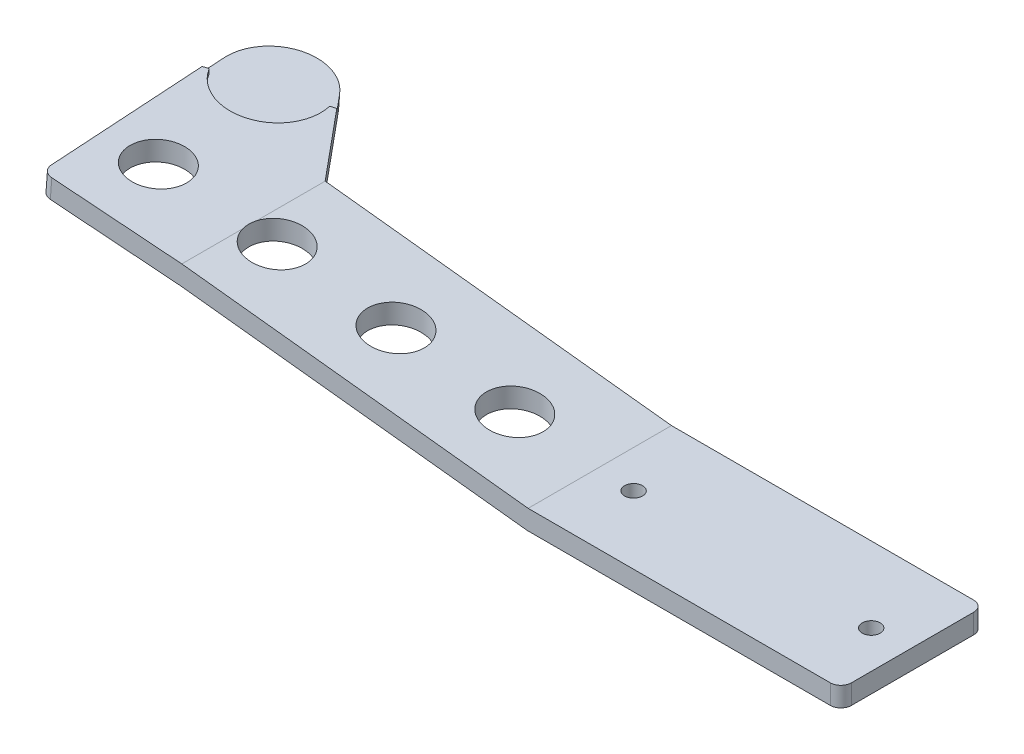
ISO-10303-21;
HEADER;
FILE_DESCRIPTION(('STEP AP214'),'2;1');
FILE_NAME('part.step','',(''),(''),'','','');
FILE_SCHEMA(('AUTOMOTIVE_DESIGN { 1 0 10303 214 1 1 1 1 }'));
ENDSEC;
DATA;
#1=APPLICATION_CONTEXT('core data for automotive mechanical design processes');
#2=APPLICATION_PROTOCOL_DEFINITION('international standard','automotive_design',2000,#1);
#3=PRODUCT_CONTEXT('',#1,'mechanical');
#4=PRODUCT('Part','Part','',(#3));
#5=PRODUCT_RELATED_PRODUCT_CATEGORY('part','',(#4));
#6=PRODUCT_DEFINITION_FORMATION('','',#4);
#7=PRODUCT_DEFINITION_CONTEXT('part definition',#1,'design');
#8=PRODUCT_DEFINITION('design','',#6,#7);
#9=PRODUCT_DEFINITION_SHAPE('','',#8);
#10=(LENGTH_UNIT() NAMED_UNIT(*) SI_UNIT(.MILLI.,.METRE.));
#11=(NAMED_UNIT(*) PLANE_ANGLE_UNIT() SI_UNIT($,.RADIAN.));
#12=(NAMED_UNIT(*) SI_UNIT($,.STERADIAN.) SOLID_ANGLE_UNIT());
#13=UNCERTAINTY_MEASURE_WITH_UNIT(LENGTH_MEASURE(1.E-05),#10,'distance_accuracy_value','');
#14=(GEOMETRIC_REPRESENTATION_CONTEXT(3) GLOBAL_UNCERTAINTY_ASSIGNED_CONTEXT((#13)) GLOBAL_UNIT_ASSIGNED_CONTEXT((#10,
#11,#12)) REPRESENTATION_CONTEXT('',''));
#15=CARTESIAN_POINT('',(0.,0.,0.));
#16=DIRECTION('',(0.,0.,1.));
#17=DIRECTION('',(1.,0.,0.));
#18=AXIS2_PLACEMENT_3D('',#15,#16,#17);
#19=CARTESIAN_POINT('',(-130.997092737255,-22.6984514156349,-8.89));
#20=DIRECTION('',(0.0739394580692496,0.99726273195203,0.));
#21=DIRECTION('',(-0.99726273195203,0.0739394580692496,0.));
#22=AXIS2_PLACEMENT_3D('',#19,#20,#21);
#23=CYLINDRICAL_SURFACE('',#22,7.93749999999999);
#24=DIRECTION('',(0.0739394580692496,0.99726273195203,0.));
#25=VECTOR('',#24,1.);
#26=CARTESIAN_POINT('',(-138.912865672124,-22.1115569672102,-8.89));
#27=LINE('',#26,#25);
#28=CARTESIAN_POINT('',(-136.652,8.38199999999976,-8.89));
#29=VERTEX_POINT('',#28);
#30=CARTESIAN_POINT('',(-136.473584087679,10.7883949722002,-8.89));
#31=VERTEX_POINT('',#30);
#32=EDGE_CURVE('E201',#29,#31,#27,.T.);
#33=ORIENTED_EDGE('',*,*,#32,.T.);
#34=CARTESIAN_POINT('',(-128.55781115281,10.2015005237755,-8.89));
#35=DIRECTION('',(0.0739394580692496,0.99726273195203,0.));
#36=DIRECTION('',(-0.99726273195203,0.0739394580692496,0.));
#37=AXIS2_PLACEMENT_3D('',#34,#35,#36);
#38=CIRCLE('',#37,7.93749999999993);
#39=CARTESIAN_POINT('',(-122.445042320525,9.74828513701677,-13.9330704205128));
#40=VERTEX_POINT('',#39);
#41=EDGE_CURVE('E47',#40,#31,#38,.T.);
#42=ORIENTED_EDGE('',*,*,#41,.F.);
#43=DIRECTION('',(0.0739394580692496,0.99726273195203,0.));
#44=VECTOR('',#43,1.);
#45=CARTESIAN_POINT('',(-124.88432390497,-23.1516668023936,-13.9330704205129));
#46=LINE('',#45,#44);
#47=CARTESIAN_POINT('',(-122.623458232846,7.34189016481652,-13.9330704205129));
#48=VERTEX_POINT('',#47);
#49=EDGE_CURVE('E209',#48,#40,#46,.T.);
#50=ORIENTED_EDGE('',*,*,#49,.F.);
#51=CARTESIAN_POINT('',(-128.736227065131,7.79510555157529,-8.89));
#52=DIRECTION('',(0.0739394580692499,0.99726273195203,0.));
#53=DIRECTION('',(-0.99726273195203,0.0739394580692499,0.));
#54=AXIS2_PLACEMENT_3D('',#51,#52,#53);
#55=CIRCLE('',#54,7.93749999999999);
#56=EDGE_CURVE('E198',#29,#48,#55,.F.);
#57=ORIENTED_EDGE('',*,*,#56,.F.);
#58=EDGE_LOOP('',(#33,#42,#50,#57));
#59=FACE_BOUND('',#58,.T.);
#60=ADVANCED_FACE('F33',(#59),#23,.T.);
#61=CARTESIAN_POINT('',(0.,0.,0.));
#62=DIRECTION('',(0.,0.,1.));
#63=DIRECTION('',(1.,0.,0.));
#64=AXIS2_PLACEMENT_3D('',#61,#62,#63);
#65=PLANE('',#64);
#66=DIRECTION('',(-1.,0.,0.));
#67=VECTOR('',#66,1.);
#68=CARTESIAN_POINT('',(0.,3.302,0.));
#69=LINE('',#68,#67);
#70=CARTESIAN_POINT('',(-1.778,3.302,0.));
#71=VERTEX_POINT('',#70);
#72=CARTESIAN_POINT('',(-52.6489034519903,3.30199999999999,0.));
#73=VERTEX_POINT('',#72);
#74=EDGE_CURVE('E246',#71,#73,#69,.T.);
#75=ORIENTED_EDGE('',*,*,#74,.F.);
#76=DIRECTION('',(0.,1.,0.));
#77=VECTOR('',#76,1.);
#78=CARTESIAN_POINT('',(-1.778,0.,0.));
#79=LINE('',#78,#77);
#80=CARTESIAN_POINT('',(-1.778,0.,0.));
#81=VERTEX_POINT('',#80);
#82=EDGE_CURVE('E41',#71,#81,#79,.F.);
#83=ORIENTED_EDGE('',*,*,#82,.T.);
#84=DIRECTION('',(1.,0.,0.));
#85=VECTOR('',#84,1.);
#86=CARTESIAN_POINT('',(0.,0.,0.));
#87=LINE('',#86,#85);
#88=CARTESIAN_POINT('',(-52.832,0.,0.));
#89=VERTEX_POINT('',#88);
#90=EDGE_CURVE('E250',#89,#81,#87,.T.);
#91=ORIENTED_EDGE('',*,*,#90,.F.);
#92=DIRECTION('',(0.99386940137254,-0.110560449598353,0.));
#93=VECTOR('',#92,1.);
#94=CARTESIAN_POINT('',(-111.252,6.4987828950322,0.));
#95=LINE('',#94,#93);
#96=CARTESIAN_POINT('',(-111.252,6.49878289503219,0.));
#97=VERTEX_POINT('',#96);
#98=EDGE_CURVE('E267',#97,#89,#95,.T.);
#99=ORIENTED_EDGE('',*,*,#98,.F.);
#100=DIRECTION('',(-0.99726273195203,0.0739394580692499,0.));
#101=VECTOR('',#100,1.);
#102=CARTESIAN_POINT('',(-111.1914357036,6.49429251239711,0.));
#103=LINE('',#102,#101);
#104=CARTESIAN_POINT('',(-111.1914357036,6.49429251239711,0.));
#105=VERTEX_POINT('',#104);
#106=EDGE_CURVE('E200',#105,#97,#103,.T.);
#107=ORIENTED_EDGE('',*,*,#106,.F.);
#108=DIRECTION('',(0.0739394580692496,0.99726273195203,0.));
#109=VECTOR('',#108,1.);
#110=CARTESIAN_POINT('',(-113.452301375724,-23.9992644548131,0.));
#111=LINE('',#110,#109);
#112=CARTESIAN_POINT('',(-110.947287613055,9.78725405330271,0.));
#113=VERTEX_POINT('',#112);
#114=EDGE_CURVE('E206',#105,#113,#111,.T.);
#115=ORIENTED_EDGE('',*,*,#114,.T.);
#116=DIRECTION('',(-0.99386940137254,0.110560449598353,0.));
#117=VECTOR('',#116,1.);
#118=CARTESIAN_POINT('',(-52.6489034519903,3.30199999999999,0.));
#119=LINE('',#118,#117);
#120=EDGE_CURVE('E264',#73,#113,#119,.T.);
#121=ORIENTED_EDGE('',*,*,#120,.F.);
#122=EDGE_LOOP('',(#75,#83,#91,#99,#107,#115,#121));
#123=FACE_BOUND('',#122,.T.);
#124=ADVANCED_FACE('F344',(#123),#65,.F.);
#125=CARTESIAN_POINT('',(0.,0.,24.13));
#126=DIRECTION('',(-1.,0.,0.));
#127=DIRECTION('',(0.,-1.,0.));
#128=AXIS2_PLACEMENT_3D('',#125,#126,#127);
#129=PLANE('',#128);
#130=DIRECTION('',(0.,0.,-1.));
#131=VECTOR('',#130,1.);
#132=CARTESIAN_POINT('',(0.,3.302,24.13));
#133=LINE('',#132,#131);
#134=CARTESIAN_POINT('',(0.,3.302,22.352));
#135=VERTEX_POINT('',#134);
#136=CARTESIAN_POINT('',(0.,3.302,1.77800000000001));
#137=VERTEX_POINT('',#136);
#138=EDGE_CURVE('E285',#135,#137,#133,.T.);
#139=ORIENTED_EDGE('',*,*,#138,.F.);
#140=DIRECTION('',(0.,1.,0.));
#141=VECTOR('',#140,1.);
#142=CARTESIAN_POINT('',(0.,0.,22.352));
#143=LINE('',#142,#141);
#144=CARTESIAN_POINT('',(0.,0.,22.352));
#145=VERTEX_POINT('',#144);
#146=EDGE_CURVE('E315',#135,#145,#143,.F.);
#147=ORIENTED_EDGE('',*,*,#146,.T.);
#148=DIRECTION('',(0.,0.,-1.));
#149=VECTOR('',#148,1.);
#150=CARTESIAN_POINT('',(0.,0.,24.13));
#151=LINE('',#150,#149);
#152=CARTESIAN_POINT('',(0.,0.,1.77800000000001));
#153=VERTEX_POINT('',#152);
#154=EDGE_CURVE('E262',#145,#153,#151,.T.);
#155=ORIENTED_EDGE('',*,*,#154,.T.);
#156=DIRECTION('',(0.,1.,0.));
#157=VECTOR('',#156,1.);
#158=CARTESIAN_POINT('',(0.,0.,1.778));
#159=LINE('',#158,#157);
#160=EDGE_CURVE('E312',#153,#137,#159,.T.);
#161=ORIENTED_EDGE('',*,*,#160,.T.);
#162=EDGE_LOOP('',(#139,#147,#155,#161));
#163=FACE_BOUND('',#162,.T.);
#164=ADVANCED_FACE('F339',(#163),#129,.F.);
#165=CARTESIAN_POINT('',(0.,3.302,24.13));
#166=DIRECTION('',(0.,-1.,0.));
#167=DIRECTION('',(1.,0.,0.));
#168=AXIS2_PLACEMENT_3D('',#165,#166,#167);
#169=PLANE('',#168);
#170=CARTESIAN_POINT('',(-6.32445172599513,3.302,12.7));
#171=DIRECTION('',(0.,-1.,0.));
#172=DIRECTION('',(1.,0.,0.));
#173=AXIS2_PLACEMENT_3D('',#170,#171,#172);
#174=CIRCLE('',#173,1.5113);
#175=CARTESIAN_POINT('',(-4.81315172599513,3.302,12.7));
#176=VERTEX_POINT('',#175);
#177=EDGE_CURVE('E224',#176,#176,#174,.T.);
#178=ORIENTED_EDGE('',*,*,#177,.T.);
#179=EDGE_LOOP('',(#178));
#180=FACE_BOUND('',#179,.T.);
#181=CARTESIAN_POINT('',(-46.3244517259951,3.30199999999999,12.7));
#182=DIRECTION('',(0.,-1.,0.));
#183=DIRECTION('',(1.,0.,0.));
#184=AXIS2_PLACEMENT_3D('',#181,#182,#183);
#185=CIRCLE('',#184,1.5113);
#186=CARTESIAN_POINT('',(-44.8131517259951,3.30199999999999,12.7));
#187=VERTEX_POINT('',#186);
#188=EDGE_CURVE('E219',#187,#187,#185,.T.);
#189=ORIENTED_EDGE('',*,*,#188,.T.);
#190=EDGE_LOOP('',(#189));
#191=FACE_BOUND('',#190,.T.);
#192=DIRECTION('',(-1.,0.,0.));
#193=VECTOR('',#192,1.);
#194=CARTESIAN_POINT('',(0.,3.302,24.13));
#195=LINE('',#194,#193);
#196=CARTESIAN_POINT('',(-1.778,3.302,24.13));
#197=VERTEX_POINT('',#196);
#198=CARTESIAN_POINT('',(-52.6489034519903,3.30199999999999,24.13));
#199=VERTEX_POINT('',#198);
#200=EDGE_CURVE('E247',#197,#199,#195,.T.);
#201=ORIENTED_EDGE('',*,*,#200,.F.);
#202=CARTESIAN_POINT('',(-1.778,3.302,22.352));
#203=DIRECTION('',(0.,-1.,0.));
#204=DIRECTION('',(1.,0.,0.));
#205=AXIS2_PLACEMENT_3D('',#202,#203,#204);
#206=CIRCLE('',#205,1.778);
#207=EDGE_CURVE('E310',#197,#135,#206,.F.);
#208=ORIENTED_EDGE('',*,*,#207,.T.);
#209=ORIENTED_EDGE('',*,*,#138,.T.);
#210=CARTESIAN_POINT('',(-1.778,3.302,1.778));
#211=DIRECTION('',(0.,-1.,0.));
#212=DIRECTION('',(1.,0.,0.));
#213=AXIS2_PLACEMENT_3D('',#210,#211,#212);
#214=CIRCLE('',#213,1.778);
#215=EDGE_CURVE('E308',#137,#71,#214,.F.);
#216=ORIENTED_EDGE('',*,*,#215,.T.);
#217=ORIENTED_EDGE('',*,*,#74,.T.);
#218=DIRECTION('',(0.,0.,-1.));
#219=VECTOR('',#218,1.);
#220=CARTESIAN_POINT('',(-52.6489034519903,3.30199999999999,24.13));
#221=LINE('',#220,#219);
#222=EDGE_CURVE('E282',#199,#73,#221,.T.);
#223=ORIENTED_EDGE('',*,*,#222,.F.);
#224=EDGE_LOOP('',(#201,#208,#209,#216,#217,#223));
#225=FACE_BOUND('',#224,.T.);
#226=ADVANCED_FACE('F336',(#180,#191,#225),#169,.F.);
#227=CARTESIAN_POINT('',(-52.6489034519903,3.30199999999999,24.13));
#228=DIRECTION('',(-0.110560449598353,-0.993869401372539,0.));
#229=DIRECTION('',(0.99386940137254,-0.110560449598353,0.));
#230=AXIS2_PLACEMENT_3D('',#227,#228,#229);
#231=PLANE('',#230);
#232=CARTESIAN_POINT('',(-66.3244517259951,4.82330125305186,12.7));
#233=DIRECTION('',(-0.110560449598353,-0.993869401372539,0.));
#234=DIRECTION('',(-0.99386940137254,0.110560449598353,0.));
#235=AXIS2_PLACEMENT_3D('',#232,#233,#234);
#236=ELLIPSE('',#235,4.79187707501907,4.7625);
#237=CARTESIAN_POINT('',(-71.0869517259951,5.35309333688601,12.7));
#238=VERTEX_POINT('',#237);
#239=EDGE_CURVE('E239',#238,#238,#236,.T.);
#240=ORIENTED_EDGE('',*,*,#239,.T.);
#241=EDGE_LOOP('',(#240));
#242=FACE_BOUND('',#241,.T.);
#243=CARTESIAN_POINT('',(-86.3244517259951,7.04814989907453,12.7));
#244=DIRECTION('',(-0.110560449598353,-0.993869401372539,0.));
#245=DIRECTION('',(-0.99386940137254,0.110560449598353,0.));
#246=AXIS2_PLACEMENT_3D('',#243,#244,#245);
#247=ELLIPSE('',#246,4.79187707501907,4.7625);
#248=CARTESIAN_POINT('',(-91.0869517259951,7.57794198290868,12.7));
#249=VERTEX_POINT('',#248);
#250=EDGE_CURVE('E235',#249,#249,#247,.T.);
#251=ORIENTED_EDGE('',*,*,#250,.T.);
#252=EDGE_LOOP('',(#251));
#253=FACE_BOUND('',#252,.T.);
#254=DIRECTION('',(0.,0.,-1.));
#255=VECTOR('',#254,1.);
#256=CARTESIAN_POINT('',(-110.947287613055,9.78725405330271,24.13));
#257=LINE('',#256,#255);
#258=CARTESIAN_POINT('',(-110.947287613055,9.78725405330271,11.5551006108349));
#259=VERTEX_POINT('',#258);
#260=EDGE_CURVE('E278',#259,#113,#257,.T.);
#261=ORIENTED_EDGE('',*,*,#260,.F.);
#262=CARTESIAN_POINT('',(-106.324451725995,9.2729985450972,12.7));
#263=DIRECTION('',(-0.110560449598353,-0.993869401372539,0.));
#264=DIRECTION('',(-0.99386940137254,0.110560449598353,0.));
#265=AXIS2_PLACEMENT_3D('',#262,#263,#264);
#266=ELLIPSE('',#265,4.79187707501907,4.7625);
#267=CARTESIAN_POINT('',(-110.947287613055,9.78725405330271,13.8448993891651));
#268=VERTEX_POINT('',#267);
#269=EDGE_CURVE('E231',#259,#268,#266,.T.);
#270=ORIENTED_EDGE('',*,*,#269,.T.);
#271=CARTESIAN_POINT('',(-110.947287613055,9.78725405330271,24.13));
#272=VERTEX_POINT('',#271);
#273=EDGE_CURVE('E279',#272,#268,#257,.T.);
#274=ORIENTED_EDGE('',*,*,#273,.F.);
#275=DIRECTION('',(-0.99386940137254,0.110560449598353,0.));
#276=VECTOR('',#275,1.);
#277=CARTESIAN_POINT('',(-52.6489034519903,3.30199999999999,24.13));
#278=LINE('',#277,#276);
#279=EDGE_CURVE('E249',#199,#272,#278,.T.);
#280=ORIENTED_EDGE('',*,*,#279,.F.);
#281=ORIENTED_EDGE('',*,*,#222,.T.);
#282=ORIENTED_EDGE('',*,*,#120,.T.);
#283=EDGE_LOOP('',(#261,#270,#274,#280,#281,#282));
#284=FACE_BOUND('',#283,.T.);
#285=ADVANCED_FACE('F350',(#242,#253,#284),#231,.F.);
#286=CARTESIAN_POINT('',(-110.947287613055,9.78725405330271,24.13));
#287=DIRECTION('',(-0.0739394580692496,-0.99726273195203,0.));
#288=DIRECTION('',(0.99726273195203,-0.0739394580692496,0.));
#289=AXIS2_PLACEMENT_3D('',#286,#287,#288);
#290=PLANE('',#289);
#291=CARTESIAN_POINT('',(-126.324451725995,10.9273539935935,12.7));
#292=DIRECTION('',(-0.0739394580692496,-0.99726273195203,0.));
#293=DIRECTION('',(-0.99726273195203,0.0739394580692496,0.));
#294=AXIS2_PLACEMENT_3D('',#291,#292,#293);
#295=ELLIPSE('',#294,4.77557202070305,4.7625);
#296=CARTESIAN_POINT('',(-131.086951725995,11.2804572007749,12.7));
#297=VERTEX_POINT('',#296);
#298=EDGE_CURVE('E243',#297,#297,#295,.T.);
#299=ORIENTED_EDGE('',*,*,#298,.T.);
#300=EDGE_LOOP('',(#299));
#301=FACE_BOUND('',#300,.T.);
#302=CARTESIAN_POINT('',(-128.492078974586,11.0880670924809,-8.89));
#303=DIRECTION('',(0.0739394580692496,0.99726273195203,0.));
#304=DIRECTION('',(-0.99726273195203,0.0739394580692496,0.));
#305=AXIS2_PLACEMENT_3D('',#302,#303,#304);
#306=CIRCLE('',#305,7.93750000000011);
#307=CARTESIAN_POINT('',(-135.300102272155,11.5928303178747,-4.84031617085422));
#308=VERTEX_POINT('',#307);
#309=CARTESIAN_POINT('',(-120.756924214141,10.5145641100225,-10.5759363603277));
#310=VERTEX_POINT('',#309);
#311=EDGE_CURVE('E162',#308,#310,#306,.T.);
#312=ORIENTED_EDGE('',*,*,#311,.F.);
#313=DIRECTION('',(0.928061912755251,-0.0688087428570762,-0.366014266114714));
#314=VECTOR('',#313,1.);
#315=CARTESIAN_POINT('',(-135.300102272155,11.5928303178747,-4.84031617085422));
#316=LINE('',#315,#314);
#317=CARTESIAN_POINT('',(-136.155447417174,11.6562476646364,-4.50298035173933));
#318=VERTEX_POINT('',#317);
#319=EDGE_CURVE('E177',#318,#308,#316,.T.);
#320=ORIENTED_EDGE('',*,*,#319,.F.);
#321=DIRECTION('',(0.0574388779414759,-0.00425865659171428,0.998339941675609));
#322=VECTOR('',#321,1.);
#323=CARTESIAN_POINT('',(-134.429906799805,11.5283119321189,25.4884850292074));
#324=LINE('',#323,#322);
#325=CARTESIAN_POINT('',(-134.604470644265,11.5412545154967,22.4544066394019));
#326=VERTEX_POINT('',#325);
#327=EDGE_CURVE('E195',#318,#326,#324,.T.);
#328=ORIENTED_EDGE('',*,*,#327,.T.);
#329=CARTESIAN_POINT('',(-132.83428101128,11.4100083975489,22.352));
#330=DIRECTION('',(-0.0739394580692496,-0.99726273195203,0.));
#331=DIRECTION('',(0.99726273195203,-0.0739394580692496,0.));
#332=AXIS2_PLACEMENT_3D('',#329,#330,#331);
#333=CIRCLE('',#332,1.778);
#334=CARTESIAN_POINT('',(-132.83428101128,11.4100083975489,24.13));
#335=VERTEX_POINT('',#334);
#336=EDGE_CURVE('E299',#326,#335,#333,.F.);
#337=ORIENTED_EDGE('',*,*,#336,.T.);
#338=DIRECTION('',(-0.99726273195203,0.0739394580692497,0.));
#339=VECTOR('',#338,1.);
#340=CARTESIAN_POINT('',(-110.947287613055,9.78725405330271,24.13));
#341=LINE('',#340,#339);
#342=EDGE_CURVE('E252',#272,#335,#341,.T.);
#343=ORIENTED_EDGE('',*,*,#342,.F.);
#344=ORIENTED_EDGE('',*,*,#273,.T.);
#345=CARTESIAN_POINT('',(-106.324451725995,9.44450587944562,12.7));
#346=DIRECTION('',(-0.0739394580692496,-0.99726273195203,0.));
#347=DIRECTION('',(-0.99726273195203,0.0739394580692496,0.));
#348=AXIS2_PLACEMENT_3D('',#345,#346,#347);
#349=ELLIPSE('',#348,4.77557202070305,4.7625);
#350=EDGE_CURVE('E228',#268,#259,#349,.T.);
#351=ORIENTED_EDGE('',*,*,#350,.T.);
#352=ORIENTED_EDGE('',*,*,#260,.T.);
#353=DIRECTION('',(-0.633608338266096,0.0469772464753114,-0.772226399440782));
#354=VECTOR('',#353,1.);
#355=CARTESIAN_POINT('',(-110.947287613055,9.78725405330271,0.));
#356=LINE('',#355,#354);
#357=CARTESIAN_POINT('',(-119.901579069123,10.4511467632607,-10.9132721794427));
#358=VERTEX_POINT('',#357);
#359=EDGE_CURVE('E197',#113,#358,#356,.T.);
#360=ORIENTED_EDGE('',*,*,#359,.T.);
#361=DIRECTION('',(0.928061912755221,-0.068808742857075,-0.36601426611479));
#362=VECTOR('',#361,1.);
#363=CARTESIAN_POINT('',(-119.901579069123,10.4511467632607,-10.9132721794427));
#364=LINE('',#363,#362);
#365=EDGE_CURVE('E180',#310,#358,#364,.T.);
#366=ORIENTED_EDGE('',*,*,#365,.F.);
#367=EDGE_LOOP('',(#312,#320,#328,#337,#343,#344,#351,#352,#360,#366));
#368=FACE_BOUND('',#367,.T.);
#369=ADVANCED_FACE('F389',(#301,#368),#290,.F.);
#370=CARTESIAN_POINT('',(-136.652,8.38199999999996,24.13));
#371=DIRECTION('',(0.0739394580692499,0.99726273195203,0.));
#372=DIRECTION('',(-0.99726273195203,0.0739394580692499,0.));
#373=AXIS2_PLACEMENT_3D('',#370,#371,#372);
#374=PLANE('',#373);
#375=CARTESIAN_POINT('',(-126.324451725995,7.61629072590601,12.7));
#376=DIRECTION('',(0.0739394580692499,0.99726273195203,0.));
#377=DIRECTION('',(-0.99726273195203,0.0739394580692499,0.));
#378=AXIS2_PLACEMENT_3D('',#375,#376,#377);
#379=ELLIPSE('',#378,4.77557202070305,4.7625);
#380=CARTESIAN_POINT('',(-131.086951725995,7.96939393308747,12.7));
#381=VERTEX_POINT('',#380);
#382=EDGE_CURVE('E242',#381,#381,#379,.T.);
#383=ORIENTED_EDGE('',*,*,#382,.T.);
#384=EDGE_LOOP('',(#383));
#385=FACE_BOUND('',#384,.T.);
#386=DIRECTION('',(0.99726273195203,-0.0739394580692499,0.));
#387=VECTOR('',#386,1.);
#388=CARTESIAN_POINT('',(-136.652,8.38199999999996,24.13));
#389=LINE('',#388,#387);
#390=CARTESIAN_POINT('',(-133.078429101824,8.1170468566433,24.13));
#391=VERTEX_POINT('',#390);
#392=CARTESIAN_POINT('',(-111.252,6.4987828950322,24.13));
#393=VERTEX_POINT('',#392);
#394=EDGE_CURVE('E255',#391,#393,#389,.T.);
#395=ORIENTED_EDGE('',*,*,#394,.F.);
#396=CARTESIAN_POINT('',(-133.078429101824,8.11704685664329,22.352));
#397=DIRECTION('',(0.0739394580692499,0.99726273195203,0.));
#398=DIRECTION('',(-0.99726273195203,0.0739394580692499,0.));
#399=AXIS2_PLACEMENT_3D('',#396,#397,#398);
#400=CIRCLE('',#399,1.778);
#401=CARTESIAN_POINT('',(-134.84861873481,8.24829297459114,22.4544066394019));
#402=VERTEX_POINT('',#401);
#403=EDGE_CURVE('E306',#391,#402,#400,.F.);
#404=ORIENTED_EDGE('',*,*,#403,.T.);
#405=DIRECTION('',(-0.0574388779414759,0.0042586565917143,-0.998339941675609));
#406=VECTOR('',#405,1.);
#407=CARTESIAN_POINT('',(-134.758516769697,8.24161259813867,24.0204607445632));
#408=LINE('',#407,#406);
#409=EDGE_CURVE('E190',#402,#29,#408,.T.);
#410=ORIENTED_EDGE('',*,*,#409,.T.);
#411=ORIENTED_EDGE('',*,*,#56,.T.);
#412=DIRECTION('',(0.633608338266096,-0.0469772464753116,0.772226399440782));
#413=VECTOR('',#412,1.);
#414=CARTESIAN_POINT('',(-111.1914357036,6.49429251239711,0.));
#415=LINE('',#414,#413);
#416=EDGE_CURVE('E203',#48,#105,#415,.T.);
#417=ORIENTED_EDGE('',*,*,#416,.T.);
#418=ORIENTED_EDGE('',*,*,#106,.T.);
#419=DIRECTION('',(0.,0.,-1.));
#420=VECTOR('',#419,1.);
#421=CARTESIAN_POINT('',(-111.252,6.4987828950322,24.13));
#422=LINE('',#421,#420);
#423=EDGE_CURVE('E275',#393,#97,#422,.T.);
#424=ORIENTED_EDGE('',*,*,#423,.F.);
#425=EDGE_LOOP('',(#395,#404,#410,#411,#417,#418,#424));
#426=FACE_BOUND('',#425,.T.);
#427=ADVANCED_FACE('F364',(#385,#426),#374,.F.);
#428=CARTESIAN_POINT('',(-111.252,6.4987828950322,24.13));
#429=DIRECTION('',(0.110560449598353,0.993869401372539,0.));
#430=DIRECTION('',(-0.99386940137254,0.110560449598353,0.));
#431=AXIS2_PLACEMENT_3D('',#428,#429,#430);
#432=PLANE('',#431);
#433=CARTESIAN_POINT('',(-66.3244517259951,1.50093314770531,12.7));
#434=DIRECTION('',(0.110560449598353,0.993869401372539,0.));
#435=DIRECTION('',(-0.99386940137254,0.110560449598353,0.));
#436=AXIS2_PLACEMENT_3D('',#433,#434,#435);
#437=ELLIPSE('',#436,4.79187707501907,4.7625);
#438=CARTESIAN_POINT('',(-71.0869517259951,2.03072523153946,12.7));
#439=VERTEX_POINT('',#438);
#440=EDGE_CURVE('E238',#439,#439,#437,.T.);
#441=ORIENTED_EDGE('',*,*,#440,.T.);
#442=EDGE_LOOP('',(#441));
#443=FACE_BOUND('',#442,.T.);
#444=CARTESIAN_POINT('',(-86.3244517259951,3.72578179372798,12.7));
#445=DIRECTION('',(0.110560449598353,0.993869401372539,0.));
#446=DIRECTION('',(-0.99386940137254,0.110560449598353,0.));
#447=AXIS2_PLACEMENT_3D('',#444,#445,#446);
#448=ELLIPSE('',#447,4.79187707501907,4.7625);
#449=CARTESIAN_POINT('',(-91.0869517259951,4.25557387756212,12.7));
#450=VERTEX_POINT('',#449);
#451=EDGE_CURVE('E234',#450,#450,#448,.T.);
#452=ORIENTED_EDGE('',*,*,#451,.T.);
#453=EDGE_LOOP('',(#452));
#454=FACE_BOUND('',#453,.T.);
#455=CARTESIAN_POINT('',(-106.324451725995,5.95063043975065,12.7));
#456=DIRECTION('',(0.110560449598353,0.993869401372539,0.));
#457=DIRECTION('',(-0.99386940137254,0.110560449598353,0.));
#458=AXIS2_PLACEMENT_3D('',#455,#456,#457);
#459=ELLIPSE('',#458,4.79187707501907,4.7625);
#460=CARTESIAN_POINT('',(-111.086951725995,6.48042252358479,12.7));
#461=VERTEX_POINT('',#460);
#462=EDGE_CURVE('E227',#461,#461,#459,.T.);
#463=ORIENTED_EDGE('',*,*,#462,.T.);
#464=EDGE_LOOP('',(#463));
#465=FACE_BOUND('',#464,.T.);
#466=ORIENTED_EDGE('',*,*,#98,.T.);
#467=DIRECTION('',(0.,0.,-1.));
#468=VECTOR('',#467,1.);
#469=CARTESIAN_POINT('',(-52.832,0.,24.13));
#470=LINE('',#469,#468);
#471=CARTESIAN_POINT('',(-52.832,0.,24.13));
#472=VERTEX_POINT('',#471);
#473=EDGE_CURVE('E272',#472,#89,#470,.T.);
#474=ORIENTED_EDGE('',*,*,#473,.F.);
#475=DIRECTION('',(0.99386940137254,-0.110560449598353,0.));
#476=VECTOR('',#475,1.);
#477=CARTESIAN_POINT('',(-111.252,6.4987828950322,24.13));
#478=LINE('',#477,#476);
#479=EDGE_CURVE('E257',#393,#472,#478,.T.);
#480=ORIENTED_EDGE('',*,*,#479,.F.);
#481=ORIENTED_EDGE('',*,*,#423,.T.);
#482=EDGE_LOOP('',(#466,#474,#480,#481));
#483=FACE_BOUND('',#482,.T.);
#484=ADVANCED_FACE('F379',(#443,#454,#465,#483),#432,.F.);
#485=CARTESIAN_POINT('',(0.,0.,24.13));
#486=DIRECTION('',(0.,1.,0.));
#487=DIRECTION('',(-1.,0.,0.));
#488=AXIS2_PLACEMENT_3D('',#485,#486,#487);
#489=PLANE('',#488);
#490=CARTESIAN_POINT('',(-6.32445172599513,0.,12.7));
#491=DIRECTION('',(0.,1.,0.));
#492=DIRECTION('',(-1.,0.,0.));
#493=AXIS2_PLACEMENT_3D('',#490,#491,#492);
#494=CIRCLE('',#493,1.5113);
#495=CARTESIAN_POINT('',(-7.83575172599513,0.,12.7));
#496=VERTEX_POINT('',#495);
#497=EDGE_CURVE('E216',#496,#496,#494,.T.);
#498=ORIENTED_EDGE('',*,*,#497,.T.);
#499=EDGE_LOOP('',(#498));
#500=FACE_BOUND('',#499,.T.);
#501=CARTESIAN_POINT('',(-46.3244517259951,0.,12.7));
#502=DIRECTION('',(0.,1.,0.));
#503=DIRECTION('',(-1.,0.,0.));
#504=AXIS2_PLACEMENT_3D('',#501,#502,#503);
#505=CIRCLE('',#504,1.5113);
#506=CARTESIAN_POINT('',(-47.8357517259951,0.,12.7));
#507=VERTEX_POINT('',#506);
#508=EDGE_CURVE('E215',#507,#507,#505,.T.);
#509=ORIENTED_EDGE('',*,*,#508,.T.);
#510=EDGE_LOOP('',(#509));
#511=FACE_BOUND('',#510,.T.);
#512=ORIENTED_EDGE('',*,*,#154,.F.);
#513=CARTESIAN_POINT('',(-1.778,0.,22.352));
#514=DIRECTION('',(0.,1.,0.));
#515=DIRECTION('',(-1.,0.,0.));
#516=AXIS2_PLACEMENT_3D('',#513,#514,#515);
#517=CIRCLE('',#516,1.778);
#518=CARTESIAN_POINT('',(-1.778,0.,24.13));
#519=VERTEX_POINT('',#518);
#520=EDGE_CURVE('E319',#145,#519,#517,.F.);
#521=ORIENTED_EDGE('',*,*,#520,.T.);
#522=DIRECTION('',(1.,0.,0.));
#523=VECTOR('',#522,1.);
#524=CARTESIAN_POINT('',(0.,0.,24.13));
#525=LINE('',#524,#523);
#526=EDGE_CURVE('E259',#472,#519,#525,.T.);
#527=ORIENTED_EDGE('',*,*,#526,.F.);
#528=ORIENTED_EDGE('',*,*,#473,.T.);
#529=ORIENTED_EDGE('',*,*,#90,.T.);
#530=CARTESIAN_POINT('',(-1.778,0.,1.778));
#531=DIRECTION('',(0.,1.,0.));
#532=DIRECTION('',(-1.,0.,0.));
#533=AXIS2_PLACEMENT_3D('',#530,#531,#532);
#534=CIRCLE('',#533,1.778);
#535=EDGE_CURVE('E317',#81,#153,#534,.F.);
#536=ORIENTED_EDGE('',*,*,#535,.T.);
#537=EDGE_LOOP('',(#512,#521,#527,#528,#529,#536));
#538=FACE_BOUND('',#537,.T.);
#539=ADVANCED_FACE('F324',(#500,#511,#538),#489,.F.);
#540=CARTESIAN_POINT('',(0.,0.,24.13));
#541=DIRECTION('',(0.,0.,1.));
#542=DIRECTION('',(1.,0.,0.));
#543=AXIS2_PLACEMENT_3D('',#540,#541,#542);
#544=PLANE('',#543);
#545=ORIENTED_EDGE('',*,*,#342,.T.);
#546=DIRECTION('',(0.0739394580692496,0.99726273195203,0.));
#547=VECTOR('',#546,1.);
#548=CARTESIAN_POINT('',(-133.078429101824,8.1170468566433,24.13));
#549=LINE('',#548,#547);
#550=EDGE_CURVE('E304',#335,#391,#549,.F.);
#551=ORIENTED_EDGE('',*,*,#550,.T.);
#552=ORIENTED_EDGE('',*,*,#394,.T.);
#553=ORIENTED_EDGE('',*,*,#479,.T.);
#554=ORIENTED_EDGE('',*,*,#526,.T.);
#555=DIRECTION('',(0.,1.,0.));
#556=VECTOR('',#555,1.);
#557=CARTESIAN_POINT('',(-1.778,3.302,24.13));
#558=LINE('',#557,#556);
#559=EDGE_CURVE('E301',#519,#197,#558,.T.);
#560=ORIENTED_EDGE('',*,*,#559,.T.);
#561=ORIENTED_EDGE('',*,*,#200,.T.);
#562=ORIENTED_EDGE('',*,*,#279,.T.);
#563=EDGE_LOOP('',(#545,#551,#552,#553,#554,#560,#561,#562));
#564=FACE_BOUND('',#563,.T.);
#565=ADVANCED_FACE('F329',(#564),#544,.T.);
#566=CARTESIAN_POINT('',(-46.3244517259951,0.,12.7));
#567=DIRECTION('',(0.,1.,0.));
#568=DIRECTION('',(-1.,0.,0.));
#569=AXIS2_PLACEMENT_3D('',#566,#567,#568);
#570=CYLINDRICAL_SURFACE('',#569,1.5113);
#571=ORIENTED_EDGE('',*,*,#508,.F.);
#572=EDGE_LOOP('',(#571));
#573=FACE_BOUND('',#572,.T.);
#574=ORIENTED_EDGE('',*,*,#188,.F.);
#575=EDGE_LOOP('',(#574));
#576=FACE_BOUND('',#575,.T.);
#577=ADVANCED_FACE('F409',(#573,#576),#570,.F.);
#578=CARTESIAN_POINT('',(-6.32445172599513,0.,12.7));
#579=DIRECTION('',(0.,1.,0.));
#580=DIRECTION('',(-1.,0.,0.));
#581=AXIS2_PLACEMENT_3D('',#578,#579,#580);
#582=CYLINDRICAL_SURFACE('',#581,1.5113);
#583=ORIENTED_EDGE('',*,*,#497,.F.);
#584=EDGE_LOOP('',(#583));
#585=FACE_BOUND('',#584,.T.);
#586=ORIENTED_EDGE('',*,*,#177,.F.);
#587=EDGE_LOOP('',(#586));
#588=FACE_BOUND('',#587,.T.);
#589=ADVANCED_FACE('F405',(#585,#588),#582,.F.);
#590=CARTESIAN_POINT('',(-106.324451725995,0.,12.7));
#591=DIRECTION('',(0.,1.,0.));
#592=DIRECTION('',(-1.,0.,0.));
#593=AXIS2_PLACEMENT_3D('',#590,#591,#592);
#594=CYLINDRICAL_SURFACE('',#593,4.7625);
#595=ORIENTED_EDGE('',*,*,#462,.F.);
#596=EDGE_LOOP('',(#595));
#597=FACE_BOUND('',#596,.T.);
#598=ORIENTED_EDGE('',*,*,#350,.F.);
#599=ORIENTED_EDGE('',*,*,#269,.F.);
#600=EDGE_LOOP('',(#598,#599));
#601=FACE_BOUND('',#600,.T.);
#602=ADVANCED_FACE('F408',(#597,#601),#594,.F.);
#603=CARTESIAN_POINT('',(-86.3244517259951,0.,12.7));
#604=DIRECTION('',(0.,1.,0.));
#605=DIRECTION('',(-1.,0.,0.));
#606=AXIS2_PLACEMENT_3D('',#603,#604,#605);
#607=CYLINDRICAL_SURFACE('',#606,4.7625);
#608=ORIENTED_EDGE('',*,*,#451,.F.);
#609=EDGE_LOOP('',(#608));
#610=FACE_BOUND('',#609,.T.);
#611=ORIENTED_EDGE('',*,*,#250,.F.);
#612=EDGE_LOOP('',(#611));
#613=FACE_BOUND('',#612,.T.);
#614=ADVANCED_FACE('F417',(#610,#613),#607,.F.);
#615=CARTESIAN_POINT('',(-66.3244517259951,0.,12.7));
#616=DIRECTION('',(0.,1.,0.));
#617=DIRECTION('',(-1.,0.,0.));
#618=AXIS2_PLACEMENT_3D('',#615,#616,#617);
#619=CYLINDRICAL_SURFACE('',#618,4.7625);
#620=ORIENTED_EDGE('',*,*,#440,.F.);
#621=EDGE_LOOP('',(#620));
#622=FACE_BOUND('',#621,.T.);
#623=ORIENTED_EDGE('',*,*,#239,.F.);
#624=EDGE_LOOP('',(#623));
#625=FACE_BOUND('',#624,.T.);
#626=ADVANCED_FACE('F414',(#622,#625),#619,.F.);
#627=CARTESIAN_POINT('',(-126.324451725995,0.,12.7));
#628=DIRECTION('',(0.,1.,0.));
#629=DIRECTION('',(-1.,0.,0.));
#630=AXIS2_PLACEMENT_3D('',#627,#628,#629);
#631=CYLINDRICAL_SURFACE('',#630,4.7625);
#632=ORIENTED_EDGE('',*,*,#382,.F.);
#633=EDGE_LOOP('',(#632));
#634=FACE_BOUND('',#633,.T.);
#635=ORIENTED_EDGE('',*,*,#298,.F.);
#636=EDGE_LOOP('',(#635));
#637=FACE_BOUND('',#636,.T.);
#638=ADVANCED_FACE('F404',(#634,#637),#631,.F.);
#639=CARTESIAN_POINT('',(-113.452301375724,-23.9992644548131,0.));
#640=DIRECTION('',(0.770112608791794,-0.0570980014814193,-0.635347454552803));
#641=DIRECTION('',(-0.636385667912299,0.,-0.771371040210752));
#642=AXIS2_PLACEMENT_3D('',#639,#640,#641);
#643=PLANE('',#642);
#644=DIRECTION('',(0.0739394580692497,0.99726273195203,0.));
#645=VECTOR('',#644,1.);
#646=CARTESIAN_POINT('',(-119.967311247346,9.56458019455535,-10.9132721794427));
#647=LINE('',#646,#645);
#648=CARTESIAN_POINT('',(-119.967311247346,9.56458019455535,-10.9132721794427));
#649=VERTEX_POINT('',#648);
#650=EDGE_CURVE('E165',#649,#358,#647,.T.);
#651=ORIENTED_EDGE('',*,*,#650,.T.);
#652=ORIENTED_EDGE('',*,*,#359,.F.);
#653=ORIENTED_EDGE('',*,*,#114,.F.);
#654=ORIENTED_EDGE('',*,*,#416,.F.);
#655=ORIENTED_EDGE('',*,*,#49,.T.);
#656=DIRECTION('',(-0.633608338266071,0.0469772464753092,-0.772226399440802));
#657=VECTOR('',#656,1.);
#658=CARTESIAN_POINT('',(-122.445042320525,9.74828513701677,-13.9330704205128));
#659=LINE('',#658,#657);
#660=EDGE_CURVE('E173',#649,#40,#659,.T.);
#661=ORIENTED_EDGE('',*,*,#660,.F.);
#662=EDGE_LOOP('',(#651,#652,#653,#654,#655,#661));
#663=FACE_BOUND('',#662,.T.);
#664=ADVANCED_FACE('F376',(#663),#643,.T.);
#665=CARTESIAN_POINT('',(-137.27006408682,0.0458247582781259,-8.89));
#666=DIRECTION('',(0.995607217652248,-0.0738167142563808,-0.0575965350966698));
#667=DIRECTION('',(0.0739394580692496,0.99726273195203,0.));
#668=AXIS2_PLACEMENT_3D('',#665,#666,#667);
#669=PLANE('',#668);
#670=ORIENTED_EDGE('',*,*,#327,.F.);
#671=DIRECTION('',(0.0739394580692497,0.99726273195203,0.));
#672=VECTOR('',#671,1.);
#673=CARTESIAN_POINT('',(-136.221179595397,10.7696810959311,-4.50298035173933));
#674=LINE('',#673,#672);
#675=CARTESIAN_POINT('',(-136.221179595397,10.7696810959311,-4.50298035173933));
#676=VERTEX_POINT('',#675);
#677=EDGE_CURVE('E191',#676,#318,#674,.T.);
#678=ORIENTED_EDGE('',*,*,#677,.F.);
#679=DIRECTION('',(0.0574388779414759,-0.00425865659171428,0.998339941675609));
#680=VECTOR('',#679,1.);
#681=CARTESIAN_POINT('',(-136.473584087679,10.7883949722002,-8.89));
#682=LINE('',#681,#680);
#683=EDGE_CURVE('E11',#31,#676,#682,.T.);
#684=ORIENTED_EDGE('',*,*,#683,.F.);
#685=ORIENTED_EDGE('',*,*,#32,.F.);
#686=ORIENTED_EDGE('',*,*,#409,.F.);
#687=DIRECTION('',(0.0739394580692497,0.99726273195203,0.));
#688=VECTOR('',#687,1.);
#689=CARTESIAN_POINT('',(-134.604470644265,11.5412545154967,22.4544066394019));
#690=LINE('',#689,#688);
#691=EDGE_CURVE('E288',#402,#326,#690,.T.);
#692=ORIENTED_EDGE('',*,*,#691,.T.);
#693=EDGE_LOOP('',(#670,#678,#684,#685,#686,#692));
#694=FACE_BOUND('',#693,.T.);
#695=ADVANCED_FACE('F369',(#694),#669,.F.);
#696=CARTESIAN_POINT('',(-133.696493188644,-0.21912838507854,22.352));
#697=DIRECTION('',(-0.0739394580692496,-0.99726273195203,0.));
#698=DIRECTION('',(0.99726273195203,-0.0739394580692496,0.));
#699=AXIS2_PLACEMENT_3D('',#696,#697,#698);
#700=CYLINDRICAL_SURFACE('',#699,1.778);
#701=ORIENTED_EDGE('',*,*,#403,.F.);
#702=ORIENTED_EDGE('',*,*,#550,.F.);
#703=ORIENTED_EDGE('',*,*,#336,.F.);
#704=ORIENTED_EDGE('',*,*,#691,.F.);
#705=EDGE_LOOP('',(#701,#702,#703,#704));
#706=FACE_BOUND('',#705,.T.);
#707=ADVANCED_FACE('F360',(#706),#700,.T.);
#708=CARTESIAN_POINT('',(-1.778,0.,22.352));
#709=DIRECTION('',(0.,-1.,0.));
#710=DIRECTION('',(1.,0.,0.));
#711=AXIS2_PLACEMENT_3D('',#708,#709,#710);
#712=CYLINDRICAL_SURFACE('',#711,1.778);
#713=ORIENTED_EDGE('',*,*,#520,.F.);
#714=ORIENTED_EDGE('',*,*,#146,.F.);
#715=ORIENTED_EDGE('',*,*,#207,.F.);
#716=ORIENTED_EDGE('',*,*,#559,.F.);
#717=EDGE_LOOP('',(#713,#714,#715,#716));
#718=FACE_BOUND('',#717,.T.);
#719=ADVANCED_FACE('F333',(#718),#712,.T.);
#720=CARTESIAN_POINT('',(-1.778,0.,1.778));
#721=DIRECTION('',(0.,1.,0.));
#722=DIRECTION('',(-1.,0.,0.));
#723=AXIS2_PLACEMENT_3D('',#720,#721,#722);
#724=CYLINDRICAL_SURFACE('',#723,1.778);
#725=ORIENTED_EDGE('',*,*,#535,.F.);
#726=ORIENTED_EDGE('',*,*,#82,.F.);
#727=ORIENTED_EDGE('',*,*,#215,.F.);
#728=ORIENTED_EDGE('',*,*,#160,.F.);
#729=EDGE_LOOP('',(#725,#726,#727,#728));
#730=FACE_BOUND('',#729,.T.);
#731=ADVANCED_FACE('F35',(#730),#724,.T.);
#732=CARTESIAN_POINT('',(-128.55781115281,10.2015005237755,-8.89));
#733=DIRECTION('',(0.0739394580692496,0.99726273195203,0.));
#734=DIRECTION('',(-0.99726273195203,0.0739394580692496,0.));
#735=AXIS2_PLACEMENT_3D('',#732,#733,#734);
#736=PLANE('',#735);
#737=ORIENTED_EDGE('',*,*,#683,.T.);
#738=DIRECTION('',(0.928061912755251,-0.0688087428570762,-0.366014266114714));
#739=VECTOR('',#738,1.);
#740=CARTESIAN_POINT('',(-135.365834450379,10.7062637491693,-4.84031617085422));
#741=LINE('',#740,#739);
#742=CARTESIAN_POINT('',(-135.365834450379,10.7062637491693,-4.84031617085422));
#743=VERTEX_POINT('',#742);
#744=EDGE_CURVE('E166',#676,#743,#741,.T.);
#745=ORIENTED_EDGE('',*,*,#744,.T.);
#746=CARTESIAN_POINT('',(-128.55781115281,10.2015005237755,-8.89));
#747=DIRECTION('',(0.0739394580692496,0.99726273195203,0.));
#748=DIRECTION('',(-0.99726273195203,0.0739394580692496,0.));
#749=AXIS2_PLACEMENT_3D('',#746,#747,#748);
#750=CIRCLE('',#749,7.93750000000011);
#751=CARTESIAN_POINT('',(-120.822656392364,9.62799754131714,-10.5759363603277));
#752=VERTEX_POINT('',#751);
#753=EDGE_CURVE('E159',#743,#752,#750,.T.);
#754=ORIENTED_EDGE('',*,*,#753,.T.);
#755=DIRECTION('',(0.928061912755221,-0.068808742857075,-0.36601426611479));
#756=VECTOR('',#755,1.);
#757=CARTESIAN_POINT('',(-119.967311247346,9.56458019455535,-10.9132721794427));
#758=LINE('',#757,#756);
#759=EDGE_CURVE('E169',#752,#649,#758,.T.);
#760=ORIENTED_EDGE('',*,*,#759,.T.);
#761=ORIENTED_EDGE('',*,*,#660,.T.);
#762=ORIENTED_EDGE('',*,*,#41,.T.);
#763=EDGE_LOOP('',(#737,#745,#754,#760,#761,#762));
#764=FACE_BOUND('',#763,.T.);
#765=ADVANCED_FACE('F175',(#764),#736,.T.);
#766=CARTESIAN_POINT('',(-128.55781115281,10.2015005237755,-8.89));
#767=DIRECTION('',(0.0739394580692497,0.99726273195203,0.));
#768=DIRECTION('',(-0.99726273195203,0.0739394580692497,0.));
#769=AXIS2_PLACEMENT_3D('',#766,#767,#768);
#770=CYLINDRICAL_SURFACE('',#769,7.93750000000011);
#771=ORIENTED_EDGE('',*,*,#311,.T.);
#772=DIRECTION('',(0.0739394580692497,0.99726273195203,0.));
#773=VECTOR('',#772,1.);
#774=CARTESIAN_POINT('',(-120.822656392364,9.62799754131714,-10.5759363603277));
#775=LINE('',#774,#773);
#776=EDGE_CURVE('E155',#752,#310,#775,.T.);
#777=ORIENTED_EDGE('',*,*,#776,.F.);
#778=ORIENTED_EDGE('',*,*,#753,.F.);
#779=DIRECTION('',(0.0739394580692497,0.99726273195203,0.));
#780=VECTOR('',#779,1.);
#781=CARTESIAN_POINT('',(-135.365834450379,10.7062637491693,-4.84031617085422));
#782=LINE('',#781,#780);
#783=EDGE_CURVE('E188',#743,#308,#782,.T.);
#784=ORIENTED_EDGE('',*,*,#783,.T.);
#785=EDGE_LOOP('',(#771,#777,#778,#784));
#786=FACE_BOUND('',#785,.T.);
#787=ADVANCED_FACE('F157',(#786),#770,.F.);
#788=CARTESIAN_POINT('',(-135.365834450379,10.7062637491693,-4.84031617085422));
#789=DIRECTION('',(0.365012386958977,-0.0270628964821361,0.930609239692207));
#790=DIRECTION('',(0.930950216276052,0.,-0.365146128030372));
#791=AXIS2_PLACEMENT_3D('',#788,#789,#790);
#792=PLANE('',#791);
#793=ORIENTED_EDGE('',*,*,#319,.T.);
#794=ORIENTED_EDGE('',*,*,#783,.F.);
#795=ORIENTED_EDGE('',*,*,#744,.F.);
#796=ORIENTED_EDGE('',*,*,#677,.T.);
#797=EDGE_LOOP('',(#793,#794,#795,#796));
#798=FACE_BOUND('',#797,.T.);
#799=ADVANCED_FACE('F496',(#798),#792,.F.);
#800=CARTESIAN_POINT('',(-119.967311247346,9.56458019455535,-10.9132721794427));
#801=DIRECTION('',(0.365012386959053,-0.0270628964821417,0.930609239692177));
#802=DIRECTION('',(0.930950216276022,0.,-0.365146128030448));
#803=AXIS2_PLACEMENT_3D('',#800,#801,#802);
#804=PLANE('',#803);
#805=ORIENTED_EDGE('',*,*,#365,.T.);
#806=ORIENTED_EDGE('',*,*,#650,.F.);
#807=ORIENTED_EDGE('',*,*,#759,.F.);
#808=ORIENTED_EDGE('',*,*,#776,.T.);
#809=EDGE_LOOP('',(#805,#806,#807,#808));
#810=FACE_BOUND('',#809,.T.);
#811=ADVANCED_FACE('F170',(#810),#804,.F.);
#812=CLOSED_SHELL('',(#60,#124,#164,#226,#285,#369,#427,#484,#539,#565,#577,#589,#602,#614,#626,
#638,#664,#695,#707,#719,#731,#765,#787,#799,#811));
#813=MANIFOLD_SOLID_BREP('B2',#812);
#814=ADVANCED_BREP_SHAPE_REPRESENTATION('',(#18,#813),#14);
#815=SHAPE_DEFINITION_REPRESENTATION(#9,#814);
ENDSEC;
END-ISO-10303-21;
